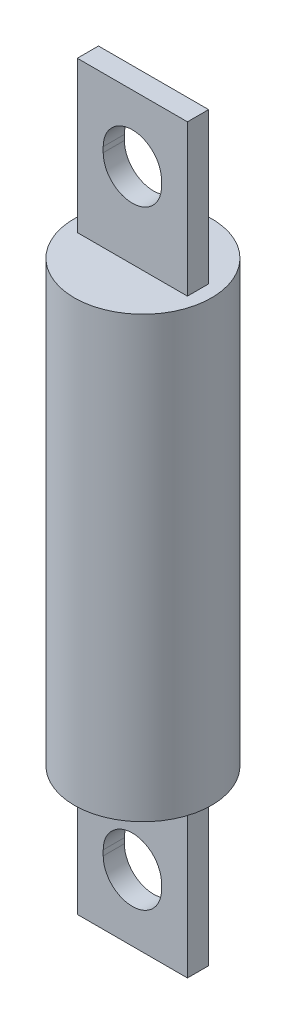
ISO-10303-21;
HEADER;
FILE_DESCRIPTION(('STEP AP214'),'2;1');
FILE_NAME('part.step','',(''),(''),'','','');
FILE_SCHEMA(('AUTOMOTIVE_DESIGN { 1 0 10303 214 1 1 1 1 }'));
ENDSEC;
DATA;
#1=APPLICATION_CONTEXT('core data for automotive mechanical design processes');
#2=APPLICATION_PROTOCOL_DEFINITION('international standard','automotive_design',2000,#1);
#3=PRODUCT_CONTEXT('',#1,'mechanical');
#4=PRODUCT('Part','Part','',(#3));
#5=PRODUCT_RELATED_PRODUCT_CATEGORY('part','',(#4));
#6=PRODUCT_DEFINITION_FORMATION('','',#4);
#7=PRODUCT_DEFINITION_CONTEXT('part definition',#1,'design');
#8=PRODUCT_DEFINITION('design','',#6,#7);
#9=PRODUCT_DEFINITION_SHAPE('','',#8);
#10=(LENGTH_UNIT() NAMED_UNIT(*) SI_UNIT(.MILLI.,.METRE.));
#11=(NAMED_UNIT(*) PLANE_ANGLE_UNIT() SI_UNIT($,.RADIAN.));
#12=(NAMED_UNIT(*) SI_UNIT($,.STERADIAN.) SOLID_ANGLE_UNIT());
#13=UNCERTAINTY_MEASURE_WITH_UNIT(LENGTH_MEASURE(1.E-05),#10,'distance_accuracy_value','');
#14=(GEOMETRIC_REPRESENTATION_CONTEXT(3) GLOBAL_UNCERTAINTY_ASSIGNED_CONTEXT((#13)) GLOBAL_UNIT_ASSIGNED_CONTEXT((#10,
#11,#12)) REPRESENTATION_CONTEXT('',''));
#15=CARTESIAN_POINT('',(0.,0.,0.));
#16=DIRECTION('',(0.,0.,1.));
#17=DIRECTION('',(1.,0.,0.));
#18=AXIS2_PLACEMENT_3D('',#15,#16,#17);
#19=CARTESIAN_POINT('',(-8.255,-22.6314,1.5875));
#20=DIRECTION('',(0.,0.,1.));
#21=DIRECTION('',(1.,0.,0.));
#22=AXIS2_PLACEMENT_3D('',#19,#20,#21);
#23=PLANE('',#22);
#24=DIRECTION('',(1.,0.,0.));
#25=VECTOR('',#24,1.);
#26=CARTESIAN_POINT('',(-8.255,0.,1.5875));
#27=LINE('',#26,#25);
#28=CARTESIAN_POINT('',(-8.255,0.,1.5875));
#29=VERTEX_POINT('',#28);
#30=CARTESIAN_POINT('',(8.255,0.,1.5875));
#31=VERTEX_POINT('',#30);
#32=EDGE_CURVE('E212',#29,#31,#27,.T.);
#33=ORIENTED_EDGE('',*,*,#32,.F.);
#34=DIRECTION('',(0.,1.,0.));
#35=VECTOR('',#34,1.);
#36=CARTESIAN_POINT('',(-8.255,-22.6314,1.5875));
#37=LINE('',#36,#35);
#38=CARTESIAN_POINT('',(-8.255,-22.6314,1.5875));
#39=VERTEX_POINT('',#38);
#40=EDGE_CURVE('E228',#39,#29,#37,.T.);
#41=ORIENTED_EDGE('',*,*,#40,.F.);
#42=DIRECTION('',(1.,0.,0.));
#43=VECTOR('',#42,1.);
#44=CARTESIAN_POINT('',(-8.255,-22.6314,1.5875));
#45=LINE('',#44,#43);
#46=CARTESIAN_POINT('',(8.255,-22.6314,1.5875));
#47=VERTEX_POINT('',#46);
#48=EDGE_CURVE('E195',#39,#47,#45,.T.);
#49=ORIENTED_EDGE('',*,*,#48,.T.);
#50=DIRECTION('',(0.,1.,0.));
#51=VECTOR('',#50,1.);
#52=CARTESIAN_POINT('',(8.255,-22.6314,1.5875));
#53=LINE('',#52,#51);
#54=EDGE_CURVE('E231',#47,#31,#53,.T.);
#55=ORIENTED_EDGE('',*,*,#54,.T.);
#56=EDGE_LOOP('',(#33,#41,#49,#55));
#57=FACE_BOUND('',#56,.T.);
#58=DIRECTION('',(0.,-1.,0.));
#59=VECTOR('',#58,1.);
#60=CARTESIAN_POINT('',(4.3688,-13.09751,1.5875));
#61=LINE('',#60,#59);
#62=CARTESIAN_POINT('',(4.3688,-12.3063,1.5875));
#63=VERTEX_POINT('',#62);
#64=CARTESIAN_POINT('',(4.3688,-13.09751,1.5875));
#65=VERTEX_POINT('',#64);
#66=EDGE_CURVE('E170',#63,#65,#61,.T.);
#67=ORIENTED_EDGE('',*,*,#66,.T.);
#68=CARTESIAN_POINT('',(0.,-13.09751,1.5875));
#69=DIRECTION('',(0.,0.,-1.));
#70=DIRECTION('',(1.,0.,0.));
#71=AXIS2_PLACEMENT_3D('',#68,#69,#70);
#72=CIRCLE('',#71,4.3688);
#73=CARTESIAN_POINT('',(-4.3688,-13.09751,1.5875));
#74=VERTEX_POINT('',#73);
#75=EDGE_CURVE('E59',#65,#74,#72,.T.);
#76=ORIENTED_EDGE('',*,*,#75,.T.);
#77=DIRECTION('',(0.,1.,0.));
#78=VECTOR('',#77,1.);
#79=CARTESIAN_POINT('',(-4.3688,-13.09751,1.5875));
#80=LINE('',#79,#78);
#81=CARTESIAN_POINT('',(-4.3688,-12.3063,1.5875));
#82=VERTEX_POINT('',#81);
#83=EDGE_CURVE('E176',#74,#82,#80,.T.);
#84=ORIENTED_EDGE('',*,*,#83,.T.);
#85=CARTESIAN_POINT('',(0.,-12.3063,1.5875));
#86=DIRECTION('',(0.,0.,-1.));
#87=DIRECTION('',(1.,0.,0.));
#88=AXIS2_PLACEMENT_3D('',#85,#86,#87);
#89=CIRCLE('',#88,4.3688);
#90=EDGE_CURVE('E160',#82,#63,#89,.T.);
#91=ORIENTED_EDGE('',*,*,#90,.T.);
#92=EDGE_LOOP('',(#67,#76,#84,#91));
#93=FACE_BOUND('',#92,.T.);
#94=ADVANCED_FACE('F43',(#57,#93),#23,.T.);
#95=CARTESIAN_POINT('',(-8.255,-22.6314,-1.5875));
#96=DIRECTION('',(0.,0.,-1.));
#97=DIRECTION('',(-1.,0.,0.));
#98=AXIS2_PLACEMENT_3D('',#95,#96,#97);
#99=PLANE('',#98);
#100=DIRECTION('',(-1.,0.,0.));
#101=VECTOR('',#100,1.);
#102=CARTESIAN_POINT('',(-8.255,0.,-1.5875));
#103=LINE('',#102,#101);
#104=CARTESIAN_POINT('',(8.255,0.,-1.5875));
#105=VERTEX_POINT('',#104);
#106=CARTESIAN_POINT('',(-8.255,0.,-1.5875));
#107=VERTEX_POINT('',#106);
#108=EDGE_CURVE('E196',#105,#107,#103,.T.);
#109=ORIENTED_EDGE('',*,*,#108,.F.);
#110=DIRECTION('',(0.,1.,0.));
#111=VECTOR('',#110,1.);
#112=CARTESIAN_POINT('',(8.255,-22.6314,-1.5875));
#113=LINE('',#112,#111);
#114=CARTESIAN_POINT('',(8.255,-22.6314,-1.5875));
#115=VERTEX_POINT('',#114);
#116=EDGE_CURVE('E208',#115,#105,#113,.T.);
#117=ORIENTED_EDGE('',*,*,#116,.F.);
#118=DIRECTION('',(-1.,0.,0.));
#119=VECTOR('',#118,1.);
#120=CARTESIAN_POINT('',(-8.255,-22.6314,-1.5875));
#121=LINE('',#120,#119);
#122=CARTESIAN_POINT('',(-8.255,-22.6314,-1.5875));
#123=VERTEX_POINT('',#122);
#124=EDGE_CURVE('E204',#115,#123,#121,.T.);
#125=ORIENTED_EDGE('',*,*,#124,.T.);
#126=DIRECTION('',(0.,1.,0.));
#127=VECTOR('',#126,1.);
#128=CARTESIAN_POINT('',(-8.255,-22.6314,-1.5875));
#129=LINE('',#128,#127);
#130=EDGE_CURVE('E225',#123,#107,#129,.T.);
#131=ORIENTED_EDGE('',*,*,#130,.T.);
#132=EDGE_LOOP('',(#109,#117,#125,#131));
#133=FACE_BOUND('',#132,.T.);
#134=DIRECTION('',(0.,-1.,0.));
#135=VECTOR('',#134,1.);
#136=CARTESIAN_POINT('',(-4.3688,-22.6314,-1.5875));
#137=LINE('',#136,#135);
#138=CARTESIAN_POINT('',(-4.3688,-12.3063,-1.5875));
#139=VERTEX_POINT('',#138);
#140=CARTESIAN_POINT('',(-4.3688,-13.09751,-1.5875));
#141=VERTEX_POINT('',#140);
#142=EDGE_CURVE('E52',#139,#141,#137,.T.);
#143=ORIENTED_EDGE('',*,*,#142,.T.);
#144=CARTESIAN_POINT('',(0.,-13.09751,-1.5875));
#145=DIRECTION('',(0.,0.,-1.));
#146=DIRECTION('',(-1.,0.,0.));
#147=AXIS2_PLACEMENT_3D('',#144,#145,#146);
#148=CIRCLE('',#147,4.3688);
#149=CARTESIAN_POINT('',(4.3688,-13.09751,-1.5875));
#150=VERTEX_POINT('',#149);
#151=EDGE_CURVE('E11',#141,#150,#148,.F.);
#152=ORIENTED_EDGE('',*,*,#151,.T.);
#153=DIRECTION('',(0.,1.,0.));
#154=VECTOR('',#153,1.);
#155=CARTESIAN_POINT('',(4.3688,-22.6314,-1.5875));
#156=LINE('',#155,#154);
#157=CARTESIAN_POINT('',(4.3688,-12.3063,-1.5875));
#158=VERTEX_POINT('',#157);
#159=EDGE_CURVE('E329',#150,#158,#156,.T.);
#160=ORIENTED_EDGE('',*,*,#159,.T.);
#161=CARTESIAN_POINT('',(0.,-12.3063,-1.5875));
#162=DIRECTION('',(0.,0.,-1.));
#163=DIRECTION('',(-1.,0.,0.));
#164=AXIS2_PLACEMENT_3D('',#161,#162,#163);
#165=CIRCLE('',#164,4.3688);
#166=EDGE_CURVE('E163',#158,#139,#165,.F.);
#167=ORIENTED_EDGE('',*,*,#166,.T.);
#168=EDGE_LOOP('',(#143,#152,#160,#167));
#169=FACE_BOUND('',#168,.T.);
#170=ADVANCED_FACE('F339',(#133,#169),#99,.T.);
#171=CARTESIAN_POINT('',(0.,65.8876,0.));
#172=DIRECTION('',(0.,-1.,0.));
#173=DIRECTION('',(0.,0.,-1.));
#174=AXIS2_PLACEMENT_3D('',#171,#172,#173);
#175=CYLINDRICAL_SURFACE('',#174,10.287);
#176=CARTESIAN_POINT('',(0.,65.8876,0.));
#177=DIRECTION('',(0.,1.,0.));
#178=DIRECTION('',(0.,0.,1.));
#179=AXIS2_PLACEMENT_3D('',#176,#177,#178);
#180=CIRCLE('',#179,10.287);
#181=CARTESIAN_POINT('',(0.,65.8876,10.287));
#182=VERTEX_POINT('',#181);
#183=EDGE_CURVE('E325',#182,#182,#180,.T.);
#184=ORIENTED_EDGE('',*,*,#183,.F.);
#185=EDGE_LOOP('',(#184));
#186=FACE_BOUND('',#185,.T.);
#187=CARTESIAN_POINT('',(0.,0.,0.));
#188=DIRECTION('',(0.,1.,0.));
#189=DIRECTION('',(0.,0.,1.));
#190=AXIS2_PLACEMENT_3D('',#187,#188,#189);
#191=CIRCLE('',#190,10.287);
#192=CARTESIAN_POINT('',(0.,0.,10.287));
#193=VERTEX_POINT('',#192);
#194=EDGE_CURVE('E324',#193,#193,#191,.T.);
#195=ORIENTED_EDGE('',*,*,#194,.T.);
#196=EDGE_LOOP('',(#195));
#197=FACE_BOUND('',#196,.T.);
#198=ADVANCED_FACE('F45',(#186,#197),#175,.T.);
#199=CARTESIAN_POINT('',(0.,65.8876,0.));
#200=DIRECTION('',(0.,1.,0.));
#201=DIRECTION('',(0.,0.,1.));
#202=AXIS2_PLACEMENT_3D('',#199,#200,#201);
#203=PLANE('',#202);
#204=DIRECTION('',(0.,0.,-1.));
#205=VECTOR('',#204,1.);
#206=CARTESIAN_POINT('',(8.255,65.8876,1.5875));
#207=LINE('',#206,#205);
#208=CARTESIAN_POINT('',(8.255,65.8876,1.5875));
#209=VERTEX_POINT('',#208);
#210=CARTESIAN_POINT('',(8.255,65.8876,-1.5875));
#211=VERTEX_POINT('',#210);
#212=EDGE_CURVE('E279',#209,#211,#207,.T.);
#213=ORIENTED_EDGE('',*,*,#212,.F.);
#214=DIRECTION('',(1.,0.,0.));
#215=VECTOR('',#214,1.);
#216=CARTESIAN_POINT('',(-8.255,65.8876,1.5875));
#217=LINE('',#216,#215);
#218=CARTESIAN_POINT('',(-8.255,65.8876,1.5875));
#219=VERTEX_POINT('',#218);
#220=EDGE_CURVE('E285',#219,#209,#217,.T.);
#221=ORIENTED_EDGE('',*,*,#220,.F.);
#222=DIRECTION('',(0.,0.,1.));
#223=VECTOR('',#222,1.);
#224=CARTESIAN_POINT('',(-8.255,65.8876,1.5875));
#225=LINE('',#224,#223);
#226=CARTESIAN_POINT('',(-8.255,65.8876,-1.5875));
#227=VERTEX_POINT('',#226);
#228=EDGE_CURVE('E302',#227,#219,#225,.T.);
#229=ORIENTED_EDGE('',*,*,#228,.F.);
#230=DIRECTION('',(-1.,0.,0.));
#231=VECTOR('',#230,1.);
#232=CARTESIAN_POINT('',(-8.255,65.8876,-1.5875));
#233=LINE('',#232,#231);
#234=EDGE_CURVE('E298',#211,#227,#233,.T.);
#235=ORIENTED_EDGE('',*,*,#234,.F.);
#236=EDGE_LOOP('',(#213,#221,#229,#235));
#237=FACE_BOUND('',#236,.T.);
#238=ORIENTED_EDGE('',*,*,#183,.T.);
#239=EDGE_LOOP('',(#238));
#240=FACE_BOUND('',#239,.T.);
#241=ADVANCED_FACE('F408',(#237,#240),#203,.T.);
#242=CARTESIAN_POINT('',(0.,0.,0.));
#243=DIRECTION('',(0.,1.,0.));
#244=DIRECTION('',(0.,0.,1.));
#245=AXIS2_PLACEMENT_3D('',#242,#243,#244);
#246=PLANE('',#245);
#247=ORIENTED_EDGE('',*,*,#32,.T.);
#248=DIRECTION('',(0.,0.,-1.));
#249=VECTOR('',#248,1.);
#250=CARTESIAN_POINT('',(8.255,0.,1.5875));
#251=LINE('',#250,#249);
#252=EDGE_CURVE('E186',#31,#105,#251,.T.);
#253=ORIENTED_EDGE('',*,*,#252,.T.);
#254=ORIENTED_EDGE('',*,*,#108,.T.);
#255=DIRECTION('',(0.,0.,1.));
#256=VECTOR('',#255,1.);
#257=CARTESIAN_POINT('',(-8.255,0.,1.5875));
#258=LINE('',#257,#256);
#259=EDGE_CURVE('E216',#107,#29,#258,.T.);
#260=ORIENTED_EDGE('',*,*,#259,.T.);
#261=EDGE_LOOP('',(#247,#253,#254,#260));
#262=FACE_BOUND('',#261,.T.);
#263=ORIENTED_EDGE('',*,*,#194,.F.);
#264=EDGE_LOOP('',(#263));
#265=FACE_BOUND('',#264,.T.);
#266=ADVANCED_FACE('F406',(#262,#265),#246,.F.);
#267=CARTESIAN_POINT('',(8.255,88.519,1.5875));
#268=DIRECTION('',(-1.,0.,0.));
#269=DIRECTION('',(0.,0.,1.));
#270=AXIS2_PLACEMENT_3D('',#267,#268,#269);
#271=PLANE('',#270);
#272=ORIENTED_EDGE('',*,*,#212,.T.);
#273=DIRECTION('',(0.,-1.,0.));
#274=VECTOR('',#273,1.);
#275=CARTESIAN_POINT('',(8.255,88.519,-1.5875));
#276=LINE('',#275,#274);
#277=CARTESIAN_POINT('',(8.255,88.519,-1.5875));
#278=VERTEX_POINT('',#277);
#279=EDGE_CURVE('E320',#278,#211,#276,.T.);
#280=ORIENTED_EDGE('',*,*,#279,.F.);
#281=DIRECTION('',(0.,0.,-1.));
#282=VECTOR('',#281,1.);
#283=CARTESIAN_POINT('',(8.255,88.519,1.5875));
#284=LINE('',#283,#282);
#285=CARTESIAN_POINT('',(8.255,88.519,1.5875));
#286=VERTEX_POINT('',#285);
#287=EDGE_CURVE('E280',#286,#278,#284,.T.);
#288=ORIENTED_EDGE('',*,*,#287,.F.);
#289=DIRECTION('',(0.,-1.,0.));
#290=VECTOR('',#289,1.);
#291=CARTESIAN_POINT('',(8.255,88.519,1.5875));
#292=LINE('',#291,#290);
#293=EDGE_CURVE('E294',#286,#209,#292,.T.);
#294=ORIENTED_EDGE('',*,*,#293,.T.);
#295=EDGE_LOOP('',(#272,#280,#288,#294));
#296=FACE_BOUND('',#295,.T.);
#297=ADVANCED_FACE('F402',(#296),#271,.F.);
#298=CARTESIAN_POINT('',(-8.255,88.519,-1.5875));
#299=DIRECTION('',(0.,0.,1.));
#300=DIRECTION('',(1.,0.,0.));
#301=AXIS2_PLACEMENT_3D('',#298,#299,#300);
#302=PLANE('',#301);
#303=DIRECTION('',(0.,1.,0.));
#304=VECTOR('',#303,1.);
#305=CARTESIAN_POINT('',(4.3688,88.519,-1.5875));
#306=LINE('',#305,#304);
#307=CARTESIAN_POINT('',(4.3688,78.1939,-1.5875));
#308=VERTEX_POINT('',#307);
#309=CARTESIAN_POINT('',(4.3688,78.98511,-1.5875));
#310=VERTEX_POINT('',#309);
#311=EDGE_CURVE('E271',#308,#310,#306,.T.);
#312=ORIENTED_EDGE('',*,*,#311,.T.);
#313=CARTESIAN_POINT('',(0.,78.98511,-1.5875));
#314=DIRECTION('',(0.,0.,1.));
#315=DIRECTION('',(1.,0.,0.));
#316=AXIS2_PLACEMENT_3D('',#313,#314,#315);
#317=CIRCLE('',#316,4.3688);
#318=CARTESIAN_POINT('',(-4.3688,78.98511,-1.5875));
#319=VERTEX_POINT('',#318);
#320=EDGE_CURVE('E275',#310,#319,#317,.T.);
#321=ORIENTED_EDGE('',*,*,#320,.T.);
#322=DIRECTION('',(0.,-1.,0.));
#323=VECTOR('',#322,1.);
#324=CARTESIAN_POINT('',(-4.3688,88.519,-1.5875));
#325=LINE('',#324,#323);
#326=CARTESIAN_POINT('',(-4.3688,78.1939,-1.5875));
#327=VERTEX_POINT('',#326);
#328=EDGE_CURVE('E254',#319,#327,#325,.T.);
#329=ORIENTED_EDGE('',*,*,#328,.T.);
#330=CARTESIAN_POINT('',(0.,78.1939,-1.5875));
#331=DIRECTION('',(0.,0.,1.));
#332=DIRECTION('',(1.,0.,0.));
#333=AXIS2_PLACEMENT_3D('',#330,#331,#332);
#334=CIRCLE('',#333,4.3688);
#335=EDGE_CURVE('E267',#327,#308,#334,.T.);
#336=ORIENTED_EDGE('',*,*,#335,.T.);
#337=EDGE_LOOP('',(#312,#321,#329,#336));
#338=FACE_BOUND('',#337,.T.);
#339=ORIENTED_EDGE('',*,*,#234,.T.);
#340=DIRECTION('',(0.,-1.,0.));
#341=VECTOR('',#340,1.);
#342=CARTESIAN_POINT('',(-8.255,88.519,-1.5875));
#343=LINE('',#342,#341);
#344=CARTESIAN_POINT('',(-8.255,88.519,-1.5875));
#345=VERTEX_POINT('',#344);
#346=EDGE_CURVE('E316',#345,#227,#343,.T.);
#347=ORIENTED_EDGE('',*,*,#346,.F.);
#348=DIRECTION('',(-1.,0.,0.));
#349=VECTOR('',#348,1.);
#350=CARTESIAN_POINT('',(-8.255,88.519,-1.5875));
#351=LINE('',#350,#349);
#352=EDGE_CURVE('E284',#278,#345,#351,.T.);
#353=ORIENTED_EDGE('',*,*,#352,.F.);
#354=ORIENTED_EDGE('',*,*,#279,.T.);
#355=EDGE_LOOP('',(#339,#347,#353,#354));
#356=FACE_BOUND('',#355,.T.);
#357=ADVANCED_FACE('F398',(#338,#356),#302,.F.);
#358=CARTESIAN_POINT('',(-8.255,88.519,1.5875));
#359=DIRECTION('',(1.,0.,0.));
#360=DIRECTION('',(0.,0.,-1.));
#361=AXIS2_PLACEMENT_3D('',#358,#359,#360);
#362=PLANE('',#361);
#363=ORIENTED_EDGE('',*,*,#228,.T.);
#364=DIRECTION('',(0.,-1.,0.));
#365=VECTOR('',#364,1.);
#366=CARTESIAN_POINT('',(-8.255,88.519,1.5875));
#367=LINE('',#366,#365);
#368=CARTESIAN_POINT('',(-8.255,88.519,1.5875));
#369=VERTEX_POINT('',#368);
#370=EDGE_CURVE('E312',#369,#219,#367,.T.);
#371=ORIENTED_EDGE('',*,*,#370,.F.);
#372=DIRECTION('',(0.,0.,1.));
#373=VECTOR('',#372,1.);
#374=CARTESIAN_POINT('',(-8.255,88.519,1.5875));
#375=LINE('',#374,#373);
#376=EDGE_CURVE('E288',#345,#369,#375,.T.);
#377=ORIENTED_EDGE('',*,*,#376,.F.);
#378=ORIENTED_EDGE('',*,*,#346,.T.);
#379=EDGE_LOOP('',(#363,#371,#377,#378));
#380=FACE_BOUND('',#379,.T.);
#381=ADVANCED_FACE('F394',(#380),#362,.F.);
#382=CARTESIAN_POINT('',(-8.255,88.519,1.5875));
#383=DIRECTION('',(0.,0.,-1.));
#384=DIRECTION('',(-1.,0.,0.));
#385=AXIS2_PLACEMENT_3D('',#382,#383,#384);
#386=PLANE('',#385);
#387=DIRECTION('',(0.,-1.,0.));
#388=VECTOR('',#387,1.);
#389=CARTESIAN_POINT('',(-4.3688,78.98511,1.5875));
#390=LINE('',#389,#388);
#391=CARTESIAN_POINT('',(-4.3688,78.98511,1.5875));
#392=VERTEX_POINT('',#391);
#393=CARTESIAN_POINT('',(-4.3688,78.1939,1.5875));
#394=VERTEX_POINT('',#393);
#395=EDGE_CURVE('E238',#392,#394,#390,.T.);
#396=ORIENTED_EDGE('',*,*,#395,.F.);
#397=CARTESIAN_POINT('',(0.,78.98511,1.5875));
#398=DIRECTION('',(0.,0.,1.));
#399=DIRECTION('',(1.,0.,0.));
#400=AXIS2_PLACEMENT_3D('',#397,#398,#399);
#401=CIRCLE('',#400,4.3688);
#402=CARTESIAN_POINT('',(4.3688,78.98511,1.5875));
#403=VERTEX_POINT('',#402);
#404=EDGE_CURVE('E235',#403,#392,#401,.T.);
#405=ORIENTED_EDGE('',*,*,#404,.F.);
#406=DIRECTION('',(0.,1.,0.));
#407=VECTOR('',#406,1.);
#408=CARTESIAN_POINT('',(4.3688,78.98511,1.5875));
#409=LINE('',#408,#407);
#410=CARTESIAN_POINT('',(4.3688,78.1939,1.5875));
#411=VERTEX_POINT('',#410);
#412=EDGE_CURVE('E246',#411,#403,#409,.T.);
#413=ORIENTED_EDGE('',*,*,#412,.F.);
#414=CARTESIAN_POINT('',(0.,78.1939,1.5875));
#415=DIRECTION('',(0.,0.,1.));
#416=DIRECTION('',(1.,0.,0.));
#417=AXIS2_PLACEMENT_3D('',#414,#415,#416);
#418=CIRCLE('',#417,4.3688);
#419=EDGE_CURVE('E242',#394,#411,#418,.T.);
#420=ORIENTED_EDGE('',*,*,#419,.F.);
#421=EDGE_LOOP('',(#396,#405,#413,#420));
#422=FACE_BOUND('',#421,.T.);
#423=ORIENTED_EDGE('',*,*,#220,.T.);
#424=ORIENTED_EDGE('',*,*,#293,.F.);
#425=DIRECTION('',(1.,0.,0.));
#426=VECTOR('',#425,1.);
#427=CARTESIAN_POINT('',(-8.255,88.519,1.5875));
#428=LINE('',#427,#426);
#429=EDGE_CURVE('E291',#369,#286,#428,.T.);
#430=ORIENTED_EDGE('',*,*,#429,.F.);
#431=ORIENTED_EDGE('',*,*,#370,.T.);
#432=EDGE_LOOP('',(#423,#424,#430,#431));
#433=FACE_BOUND('',#432,.T.);
#434=ADVANCED_FACE('F390',(#422,#433),#386,.F.);
#435=CARTESIAN_POINT('',(0.,88.519,0.));
#436=DIRECTION('',(0.,-1.,0.));
#437=DIRECTION('',(0.,0.,-1.));
#438=AXIS2_PLACEMENT_3D('',#435,#436,#437);
#439=PLANE('',#438);
#440=ORIENTED_EDGE('',*,*,#287,.T.);
#441=ORIENTED_EDGE('',*,*,#352,.T.);
#442=ORIENTED_EDGE('',*,*,#376,.T.);
#443=ORIENTED_EDGE('',*,*,#429,.T.);
#444=EDGE_LOOP('',(#440,#441,#442,#443));
#445=FACE_BOUND('',#444,.T.);
#446=ADVANCED_FACE('F386',(#445),#439,.F.);
#447=CARTESIAN_POINT('',(0.,78.98511,-10.287));
#448=DIRECTION('',(0.,0.,1.));
#449=DIRECTION('',(1.,0.,0.));
#450=AXIS2_PLACEMENT_3D('',#447,#448,#449);
#451=CYLINDRICAL_SURFACE('',#450,4.3688);
#452=DIRECTION('',(0.,0.,1.));
#453=VECTOR('',#452,1.);
#454=CARTESIAN_POINT('',(4.3688,78.98511,-10.287));
#455=LINE('',#454,#453);
#456=EDGE_CURVE('E251',#310,#403,#455,.T.);
#457=ORIENTED_EDGE('',*,*,#456,.T.);
#458=ORIENTED_EDGE('',*,*,#404,.T.);
#459=DIRECTION('',(0.,0.,1.));
#460=VECTOR('',#459,1.);
#461=CARTESIAN_POINT('',(-4.3688,78.98511,-10.287));
#462=LINE('',#461,#460);
#463=EDGE_CURVE('E250',#319,#392,#462,.T.);
#464=ORIENTED_EDGE('',*,*,#463,.F.);
#465=ORIENTED_EDGE('',*,*,#320,.F.);
#466=EDGE_LOOP('',(#457,#458,#464,#465));
#467=FACE_BOUND('',#466,.T.);
#468=ADVANCED_FACE('F376',(#467),#451,.F.);
#469=CARTESIAN_POINT('',(4.3688,78.98511,-10.287));
#470=DIRECTION('',(1.,0.,0.));
#471=DIRECTION('',(0.,0.,-1.));
#472=AXIS2_PLACEMENT_3D('',#469,#470,#471);
#473=PLANE('',#472);
#474=DIRECTION('',(0.,0.,1.));
#475=VECTOR('',#474,1.);
#476=CARTESIAN_POINT('',(4.3688,78.1939,-10.287));
#477=LINE('',#476,#475);
#478=EDGE_CURVE('E255',#308,#411,#477,.T.);
#479=ORIENTED_EDGE('',*,*,#478,.T.);
#480=ORIENTED_EDGE('',*,*,#412,.T.);
#481=ORIENTED_EDGE('',*,*,#456,.F.);
#482=ORIENTED_EDGE('',*,*,#311,.F.);
#483=EDGE_LOOP('',(#479,#480,#481,#482));
#484=FACE_BOUND('',#483,.T.);
#485=ADVANCED_FACE('F372',(#484),#473,.F.);
#486=CARTESIAN_POINT('',(0.,78.1939,-10.287));
#487=DIRECTION('',(0.,0.,1.));
#488=DIRECTION('',(1.,0.,0.));
#489=AXIS2_PLACEMENT_3D('',#486,#487,#488);
#490=CYLINDRICAL_SURFACE('',#489,4.3688);
#491=DIRECTION('',(0.,0.,1.));
#492=VECTOR('',#491,1.);
#493=CARTESIAN_POINT('',(-4.3688,78.1939,-10.287));
#494=LINE('',#493,#492);
#495=EDGE_CURVE('E258',#327,#394,#494,.T.);
#496=ORIENTED_EDGE('',*,*,#495,.T.);
#497=ORIENTED_EDGE('',*,*,#419,.T.);
#498=ORIENTED_EDGE('',*,*,#478,.F.);
#499=ORIENTED_EDGE('',*,*,#335,.F.);
#500=EDGE_LOOP('',(#496,#497,#498,#499));
#501=FACE_BOUND('',#500,.T.);
#502=ADVANCED_FACE('F375',(#501),#490,.F.);
#503=CARTESIAN_POINT('',(-4.3688,78.98511,-10.287));
#504=DIRECTION('',(-1.,0.,0.));
#505=DIRECTION('',(0.,0.,1.));
#506=AXIS2_PLACEMENT_3D('',#503,#504,#505);
#507=PLANE('',#506);
#508=ORIENTED_EDGE('',*,*,#463,.T.);
#509=ORIENTED_EDGE('',*,*,#395,.T.);
#510=ORIENTED_EDGE('',*,*,#495,.F.);
#511=ORIENTED_EDGE('',*,*,#328,.F.);
#512=EDGE_LOOP('',(#508,#509,#510,#511));
#513=FACE_BOUND('',#512,.T.);
#514=ADVANCED_FACE('F370',(#513),#507,.F.);
#515=CARTESIAN_POINT('',(8.255,-22.6314,1.5875));
#516=DIRECTION('',(1.,0.,0.));
#517=DIRECTION('',(0.,0.,-1.));
#518=AXIS2_PLACEMENT_3D('',#515,#516,#517);
#519=PLANE('',#518);
#520=ORIENTED_EDGE('',*,*,#252,.F.);
#521=ORIENTED_EDGE('',*,*,#54,.F.);
#522=DIRECTION('',(0.,0.,-1.));
#523=VECTOR('',#522,1.);
#524=CARTESIAN_POINT('',(8.255,-22.6314,1.5875));
#525=LINE('',#524,#523);
#526=EDGE_CURVE('E191',#47,#115,#525,.T.);
#527=ORIENTED_EDGE('',*,*,#526,.T.);
#528=ORIENTED_EDGE('',*,*,#116,.T.);
#529=EDGE_LOOP('',(#520,#521,#527,#528));
#530=FACE_BOUND('',#529,.T.);
#531=ADVANCED_FACE('F367',(#530),#519,.T.);
#532=CARTESIAN_POINT('',(-8.255,-22.6314,1.5875));
#533=DIRECTION('',(-1.,0.,0.));
#534=DIRECTION('',(0.,0.,1.));
#535=AXIS2_PLACEMENT_3D('',#532,#533,#534);
#536=PLANE('',#535);
#537=ORIENTED_EDGE('',*,*,#259,.F.);
#538=ORIENTED_EDGE('',*,*,#130,.F.);
#539=DIRECTION('',(0.,0.,1.));
#540=VECTOR('',#539,1.);
#541=CARTESIAN_POINT('',(-8.255,-22.6314,1.5875));
#542=LINE('',#541,#540);
#543=EDGE_CURVE('E200',#123,#39,#542,.T.);
#544=ORIENTED_EDGE('',*,*,#543,.T.);
#545=ORIENTED_EDGE('',*,*,#40,.T.);
#546=EDGE_LOOP('',(#537,#538,#544,#545));
#547=FACE_BOUND('',#546,.T.);
#548=ADVANCED_FACE('F352',(#547),#536,.T.);
#549=CARTESIAN_POINT('',(0.,-22.6314,0.));
#550=DIRECTION('',(0.,1.,0.));
#551=DIRECTION('',(0.,0.,-1.));
#552=AXIS2_PLACEMENT_3D('',#549,#550,#551);
#553=PLANE('',#552);
#554=ORIENTED_EDGE('',*,*,#526,.F.);
#555=ORIENTED_EDGE('',*,*,#48,.F.);
#556=ORIENTED_EDGE('',*,*,#543,.F.);
#557=ORIENTED_EDGE('',*,*,#124,.F.);
#558=EDGE_LOOP('',(#554,#555,#556,#557));
#559=FACE_BOUND('',#558,.T.);
#560=ADVANCED_FACE('F345',(#559),#553,.F.);
#561=CARTESIAN_POINT('',(0.,-13.09751,-10.287));
#562=DIRECTION('',(0.,0.,1.));
#563=DIRECTION('',(1.,0.,0.));
#564=AXIS2_PLACEMENT_3D('',#561,#562,#563);
#565=CYLINDRICAL_SURFACE('',#564,4.3688);
#566=DIRECTION('',(0.,0.,1.));
#567=VECTOR('',#566,1.);
#568=CARTESIAN_POINT('',(-4.3688,-13.09751,-10.287));
#569=LINE('',#568,#567);
#570=EDGE_CURVE('E183',#141,#74,#569,.T.);
#571=ORIENTED_EDGE('',*,*,#570,.T.);
#572=ORIENTED_EDGE('',*,*,#75,.F.);
#573=DIRECTION('',(0.,0.,1.));
#574=VECTOR('',#573,1.);
#575=CARTESIAN_POINT('',(4.3688,-13.09751,-10.287));
#576=LINE('',#575,#574);
#577=EDGE_CURVE('E167',#150,#65,#576,.T.);
#578=ORIENTED_EDGE('',*,*,#577,.F.);
#579=ORIENTED_EDGE('',*,*,#151,.F.);
#580=EDGE_LOOP('',(#571,#572,#578,#579));
#581=FACE_BOUND('',#580,.T.);
#582=ADVANCED_FACE('F343',(#581),#565,.F.);
#583=CARTESIAN_POINT('',(-4.3688,-13.09751,-10.287));
#584=DIRECTION('',(1.,0.,0.));
#585=DIRECTION('',(0.,0.,-1.));
#586=AXIS2_PLACEMENT_3D('',#583,#584,#585);
#587=PLANE('',#586);
#588=DIRECTION('',(0.,0.,1.));
#589=VECTOR('',#588,1.);
#590=CARTESIAN_POINT('',(-4.3688,-12.3063,-10.287));
#591=LINE('',#590,#589);
#592=EDGE_CURVE('E166',#139,#82,#591,.T.);
#593=ORIENTED_EDGE('',*,*,#592,.T.);
#594=ORIENTED_EDGE('',*,*,#83,.F.);
#595=ORIENTED_EDGE('',*,*,#570,.F.);
#596=ORIENTED_EDGE('',*,*,#142,.F.);
#597=EDGE_LOOP('',(#593,#594,#595,#596));
#598=FACE_BOUND('',#597,.T.);
#599=ADVANCED_FACE('F342',(#598),#587,.T.);
#600=CARTESIAN_POINT('',(0.,-12.3063,-10.287));
#601=DIRECTION('',(0.,0.,1.));
#602=DIRECTION('',(1.,0.,0.));
#603=AXIS2_PLACEMENT_3D('',#600,#601,#602);
#604=CYLINDRICAL_SURFACE('',#603,4.3688);
#605=DIRECTION('',(0.,0.,1.));
#606=VECTOR('',#605,1.);
#607=CARTESIAN_POINT('',(4.3688,-12.3063,-10.287));
#608=LINE('',#607,#606);
#609=EDGE_CURVE('E67',#158,#63,#608,.T.);
#610=ORIENTED_EDGE('',*,*,#609,.T.);
#611=ORIENTED_EDGE('',*,*,#90,.F.);
#612=ORIENTED_EDGE('',*,*,#592,.F.);
#613=ORIENTED_EDGE('',*,*,#166,.F.);
#614=EDGE_LOOP('',(#610,#611,#612,#613));
#615=FACE_BOUND('',#614,.T.);
#616=ADVANCED_FACE('F157',(#615),#604,.F.);
#617=CARTESIAN_POINT('',(4.3688,-13.09751,-10.287));
#618=DIRECTION('',(-1.,0.,0.));
#619=DIRECTION('',(0.,0.,1.));
#620=AXIS2_PLACEMENT_3D('',#617,#618,#619);
#621=PLANE('',#620);
#622=ORIENTED_EDGE('',*,*,#577,.T.);
#623=ORIENTED_EDGE('',*,*,#66,.F.);
#624=ORIENTED_EDGE('',*,*,#609,.F.);
#625=ORIENTED_EDGE('',*,*,#159,.F.);
#626=EDGE_LOOP('',(#622,#623,#624,#625));
#627=FACE_BOUND('',#626,.T.);
#628=ADVANCED_FACE('F171',(#627),#621,.T.);
#629=CLOSED_SHELL('',(#94,#170,#198,#241,#266,#297,#357,#381,#434,#446,#468,#485,#502,#514,#531,
#548,#560,#582,#599,#616,#628));
#630=MANIFOLD_SOLID_BREP('B2',#629);
#631=ADVANCED_BREP_SHAPE_REPRESENTATION('',(#18,#630),#14);
#632=SHAPE_DEFINITION_REPRESENTATION(#9,#631);
ENDSEC;
END-ISO-10303-21;
